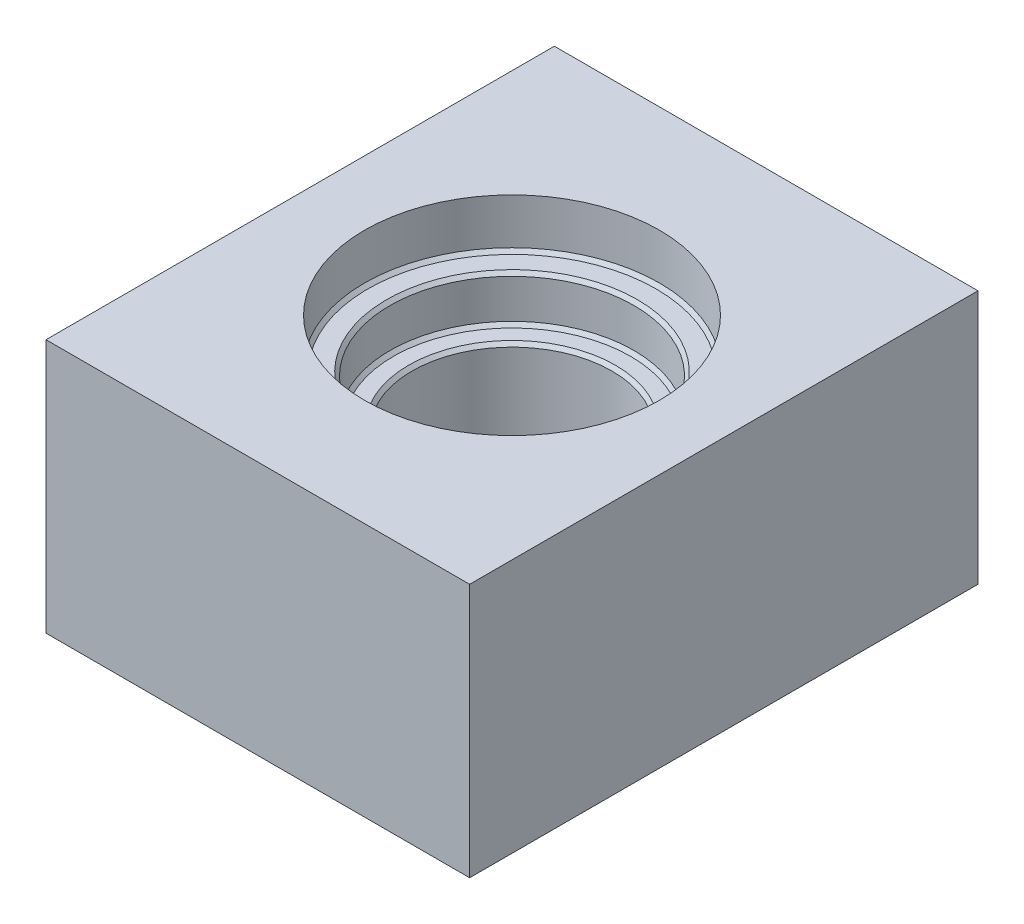
ISO-10303-21;
HEADER;
FILE_DESCRIPTION(('STEP AP214'),'2;1');
FILE_NAME('part.step','',(''),(''),'','','');
FILE_SCHEMA(('AUTOMOTIVE_DESIGN { 1 0 10303 214 1 1 1 1 }'));
ENDSEC;
DATA;
#1=APPLICATION_CONTEXT('core data for automotive mechanical design processes');
#2=APPLICATION_PROTOCOL_DEFINITION('international standard','automotive_design',2000,#1);
#3=PRODUCT_CONTEXT('',#1,'mechanical');
#4=PRODUCT('Part','Part','',(#3));
#5=PRODUCT_RELATED_PRODUCT_CATEGORY('part','',(#4));
#6=PRODUCT_DEFINITION_FORMATION('','',#4);
#7=PRODUCT_DEFINITION_CONTEXT('part definition',#1,'design');
#8=PRODUCT_DEFINITION('design','',#6,#7);
#9=PRODUCT_DEFINITION_SHAPE('','',#8);
#10=(LENGTH_UNIT() NAMED_UNIT(*) SI_UNIT(.MILLI.,.METRE.));
#11=(NAMED_UNIT(*) PLANE_ANGLE_UNIT() SI_UNIT($,.RADIAN.));
#12=(NAMED_UNIT(*) SI_UNIT($,.STERADIAN.) SOLID_ANGLE_UNIT());
#13=UNCERTAINTY_MEASURE_WITH_UNIT(LENGTH_MEASURE(1.E-05),#10,'distance_accuracy_value','');
#14=(GEOMETRIC_REPRESENTATION_CONTEXT(3) GLOBAL_UNCERTAINTY_ASSIGNED_CONTEXT((#13)) GLOBAL_UNIT_ASSIGNED_CONTEXT((#10,
#11,#12)) REPRESENTATION_CONTEXT('',''));
#15=CARTESIAN_POINT('',(0.,0.,0.));
#16=DIRECTION('',(0.,0.,1.));
#17=DIRECTION('',(1.,0.,0.));
#18=AXIS2_PLACEMENT_3D('',#15,#16,#17);
#19=CARTESIAN_POINT('',(-125.,0.,-150.));
#20=DIRECTION('',(-1.,0.,0.));
#21=DIRECTION('',(0.,0.,1.));
#22=AXIS2_PLACEMENT_3D('',#19,#20,#21);
#23=PLANE('',#22);
#24=DIRECTION('',(0.,0.,1.));
#25=VECTOR('',#24,1.);
#26=CARTESIAN_POINT('',(-125.,0.,-150.));
#27=LINE('',#26,#25);
#28=CARTESIAN_POINT('',(-125.,0.,-150.));
#29=VERTEX_POINT('',#28);
#30=CARTESIAN_POINT('',(-125.,0.,150.));
#31=VERTEX_POINT('',#30);
#32=EDGE_CURVE('E55',#29,#31,#27,.T.);
#33=ORIENTED_EDGE('',*,*,#32,.T.);
#34=DIRECTION('',(0.,-1.,0.));
#35=VECTOR('',#34,1.);
#36=CARTESIAN_POINT('',(-125.,0.,150.));
#37=LINE('',#36,#35);
#38=CARTESIAN_POINT('',(-125.,150.,150.));
#39=VERTEX_POINT('',#38);
#40=EDGE_CURVE('E106',#39,#31,#37,.T.);
#41=ORIENTED_EDGE('',*,*,#40,.F.);
#42=DIRECTION('',(0.,0.,1.));
#43=VECTOR('',#42,1.);
#44=CARTESIAN_POINT('',(-125.,150.,-150.));
#45=LINE('',#44,#43);
#46=CARTESIAN_POINT('',(-125.,150.,-150.));
#47=VERTEX_POINT('',#46);
#48=EDGE_CURVE('E12',#47,#39,#45,.T.);
#49=ORIENTED_EDGE('',*,*,#48,.F.);
#50=DIRECTION('',(0.,-1.,0.));
#51=VECTOR('',#50,1.);
#52=CARTESIAN_POINT('',(-125.,0.,-150.));
#53=LINE('',#52,#51);
#54=EDGE_CURVE('E332',#47,#29,#53,.T.);
#55=ORIENTED_EDGE('',*,*,#54,.T.);
#56=EDGE_LOOP('',(#33,#41,#49,#55));
#57=FACE_BOUND('',#56,.T.);
#58=ADVANCED_FACE('F52',(#57),#23,.T.);
#59=CARTESIAN_POINT('',(-125.,150.,-150.));
#60=DIRECTION('',(0.,1.,0.));
#61=DIRECTION('',(-1.,0.,0.));
#62=AXIS2_PLACEMENT_3D('',#59,#60,#61);
#63=PLANE('',#62);
#64=CARTESIAN_POINT('',(0.,150.,0.));
#65=DIRECTION('',(0.,-1.,0.));
#66=DIRECTION('',(0.,0.,-1.));
#67=AXIS2_PLACEMENT_3D('',#64,#65,#66);
#68=CIRCLE('',#67,87.);
#69=CARTESIAN_POINT('',(0.,150.,-87.));
#70=VERTEX_POINT('',#69);
#71=EDGE_CURVE('E331',#70,#70,#68,.T.);
#72=ORIENTED_EDGE('',*,*,#71,.T.);
#73=EDGE_LOOP('',(#72));
#74=FACE_BOUND('',#73,.T.);
#75=DIRECTION('',(-1.,0.,0.));
#76=VECTOR('',#75,1.);
#77=CARTESIAN_POINT('',(-125.,150.,150.));
#78=LINE('',#77,#76);
#79=CARTESIAN_POINT('',(125.,150.,150.));
#80=VERTEX_POINT('',#79);
#81=EDGE_CURVE('E98',#80,#39,#78,.T.);
#82=ORIENTED_EDGE('',*,*,#81,.F.);
#83=DIRECTION('',(0.,0.,1.));
#84=VECTOR('',#83,1.);
#85=CARTESIAN_POINT('',(125.,150.,-150.));
#86=LINE('',#85,#84);
#87=CARTESIAN_POINT('',(125.,150.,-150.));
#88=VERTEX_POINT('',#87);
#89=EDGE_CURVE('E62',#88,#80,#86,.T.);
#90=ORIENTED_EDGE('',*,*,#89,.F.);
#91=DIRECTION('',(-1.,0.,0.));
#92=VECTOR('',#91,1.);
#93=CARTESIAN_POINT('',(-125.,150.,-150.));
#94=LINE('',#93,#92);
#95=EDGE_CURVE('E100',#88,#47,#94,.T.);
#96=ORIENTED_EDGE('',*,*,#95,.T.);
#97=ORIENTED_EDGE('',*,*,#48,.T.);
#98=EDGE_LOOP('',(#82,#90,#96,#97));
#99=FACE_BOUND('',#98,.T.);
#100=ADVANCED_FACE('F97',(#74,#99),#63,.T.);
#101=CARTESIAN_POINT('',(125.,0.,-150.));
#102=DIRECTION('',(1.,0.,0.));
#103=DIRECTION('',(0.,1.,0.));
#104=AXIS2_PLACEMENT_3D('',#101,#102,#103);
#105=PLANE('',#104);
#106=ORIENTED_EDGE('',*,*,#89,.T.);
#107=DIRECTION('',(0.,1.,0.));
#108=VECTOR('',#107,1.);
#109=CARTESIAN_POINT('',(125.,0.,150.));
#110=LINE('',#109,#108);
#111=CARTESIAN_POINT('',(125.,0.,150.));
#112=VERTEX_POINT('',#111);
#113=EDGE_CURVE('E108',#112,#80,#110,.T.);
#114=ORIENTED_EDGE('',*,*,#113,.F.);
#115=DIRECTION('',(0.,0.,1.));
#116=VECTOR('',#115,1.);
#117=CARTESIAN_POINT('',(125.,0.,-150.));
#118=LINE('',#117,#116);
#119=CARTESIAN_POINT('',(125.,0.,-150.));
#120=VERTEX_POINT('',#119);
#121=EDGE_CURVE('E236',#120,#112,#118,.T.);
#122=ORIENTED_EDGE('',*,*,#121,.F.);
#123=DIRECTION('',(0.,1.,0.));
#124=VECTOR('',#123,1.);
#125=CARTESIAN_POINT('',(125.,0.,-150.));
#126=LINE('',#125,#124);
#127=EDGE_CURVE('E337',#120,#88,#126,.T.);
#128=ORIENTED_EDGE('',*,*,#127,.T.);
#129=EDGE_LOOP('',(#106,#114,#122,#128));
#130=FACE_BOUND('',#129,.T.);
#131=ADVANCED_FACE('F215',(#130),#105,.T.);
#132=CARTESIAN_POINT('',(-125.,0.,-150.));
#133=DIRECTION('',(0.,-1.,0.));
#134=DIRECTION('',(0.,0.,-1.));
#135=AXIS2_PLACEMENT_3D('',#132,#133,#134);
#136=PLANE('',#135);
#137=ORIENTED_EDGE('',*,*,#121,.T.);
#138=DIRECTION('',(1.,0.,0.));
#139=VECTOR('',#138,1.);
#140=CARTESIAN_POINT('',(-125.,0.,150.));
#141=LINE('',#140,#139);
#142=EDGE_CURVE('E237',#31,#112,#141,.T.);
#143=ORIENTED_EDGE('',*,*,#142,.F.);
#144=ORIENTED_EDGE('',*,*,#32,.F.);
#145=DIRECTION('',(1.,0.,0.));
#146=VECTOR('',#145,1.);
#147=CARTESIAN_POINT('',(-125.,0.,-150.));
#148=LINE('',#147,#146);
#149=EDGE_CURVE('E239',#29,#120,#148,.T.);
#150=ORIENTED_EDGE('',*,*,#149,.T.);
#151=EDGE_LOOP('',(#137,#143,#144,#150));
#152=FACE_BOUND('',#151,.T.);
#153=ADVANCED_FACE('F221',(#152),#136,.T.);
#154=CARTESIAN_POINT('',(0.,0.,-150.));
#155=DIRECTION('',(0.,0.,-1.));
#156=DIRECTION('',(-1.,0.,0.));
#157=AXIS2_PLACEMENT_3D('',#154,#155,#156);
#158=PLANE('',#157);
#159=ORIENTED_EDGE('',*,*,#54,.F.);
#160=ORIENTED_EDGE('',*,*,#95,.F.);
#161=ORIENTED_EDGE('',*,*,#127,.F.);
#162=ORIENTED_EDGE('',*,*,#149,.F.);
#163=EDGE_LOOP('',(#159,#160,#161,#162));
#164=FACE_BOUND('',#163,.T.);
#165=ADVANCED_FACE('F226',(#164),#158,.T.);
#166=CARTESIAN_POINT('',(0.,0.,0.));
#167=DIRECTION('',(0.,-1.,0.));
#168=DIRECTION('',(0.,0.,-1.));
#169=AXIS2_PLACEMENT_3D('',#166,#167,#168);
#170=CYLINDRICAL_SURFACE('',#169,87.);
#171=ORIENTED_EDGE('',*,*,#71,.F.);
#172=EDGE_LOOP('',(#171));
#173=FACE_BOUND('',#172,.T.);
#174=CARTESIAN_POINT('',(0.,123.,0.));
#175=DIRECTION('',(0.,-1.,0.));
#176=DIRECTION('',(0.,0.,-1.));
#177=AXIS2_PLACEMENT_3D('',#174,#175,#176);
#178=CIRCLE('',#177,87.);
#179=CARTESIAN_POINT('',(0.,123.,-87.));
#180=VERTEX_POINT('',#179);
#181=EDGE_CURVE('E162',#180,#180,#178,.T.);
#182=ORIENTED_EDGE('',*,*,#181,.T.);
#183=EDGE_LOOP('',(#182));
#184=FACE_BOUND('',#183,.T.);
#185=ADVANCED_FACE('F233',(#173,#184),#170,.F.);
#186=CARTESIAN_POINT('',(0.,121.,0.));
#187=DIRECTION('',(0.,1.,0.));
#188=DIRECTION('',(0.,0.,1.));
#189=AXIS2_PLACEMENT_3D('',#186,#187,#188);
#190=CONICAL_SURFACE('',#189,85.,0.785398163397445);
#191=CARTESIAN_POINT('',(0.,121.,0.));
#192=DIRECTION('',(0.,-1.,0.));
#193=DIRECTION('',(0.,0.,-1.));
#194=AXIS2_PLACEMENT_3D('',#191,#192,#193);
#195=CIRCLE('',#194,85.);
#196=CARTESIAN_POINT('',(0.,121.,-85.));
#197=VERTEX_POINT('',#196);
#198=EDGE_CURVE('E154',#197,#197,#195,.T.);
#199=ORIENTED_EDGE('',*,*,#198,.T.);
#200=EDGE_LOOP('',(#199));
#201=FACE_BOUND('',#200,.T.);
#202=ORIENTED_EDGE('',*,*,#181,.F.);
#203=EDGE_LOOP('',(#202));
#204=FACE_BOUND('',#203,.T.);
#205=ADVANCED_FACE('F376',(#201,#204),#190,.F.);
#206=CARTESIAN_POINT('',(85.,121.,0.));
#207=DIRECTION('',(0.,-1.,0.));
#208=DIRECTION('',(0.,0.,-1.));
#209=AXIS2_PLACEMENT_3D('',#206,#207,#208);
#210=PLANE('',#209);
#211=ORIENTED_EDGE('',*,*,#198,.F.);
#212=EDGE_LOOP('',(#211));
#213=FACE_BOUND('',#212,.T.);
#214=CARTESIAN_POINT('',(0.,121.,0.));
#215=DIRECTION('',(0.,-1.,0.));
#216=DIRECTION('',(0.,0.,-1.));
#217=AXIS2_PLACEMENT_3D('',#214,#215,#216);
#218=CIRCLE('',#217,74.);
#219=CARTESIAN_POINT('',(0.,121.,-74.));
#220=VERTEX_POINT('',#219);
#221=EDGE_CURVE('E148',#220,#220,#218,.T.);
#222=ORIENTED_EDGE('',*,*,#221,.T.);
#223=EDGE_LOOP('',(#222));
#224=FACE_BOUND('',#223,.T.);
#225=ADVANCED_FACE('F373',(#213,#224),#210,.F.);
#226=CARTESIAN_POINT('',(0.,119.,0.));
#227=DIRECTION('',(0.,1.,0.));
#228=DIRECTION('',(0.,0.,1.));
#229=AXIS2_PLACEMENT_3D('',#226,#227,#228);
#230=CONICAL_SURFACE('',#229,72.,0.785398163397452);
#231=CARTESIAN_POINT('',(0.,119.,0.));
#232=DIRECTION('',(0.,-1.,0.));
#233=DIRECTION('',(0.,0.,-1.));
#234=AXIS2_PLACEMENT_3D('',#231,#232,#233);
#235=CIRCLE('',#234,72.);
#236=CARTESIAN_POINT('',(0.,119.,-72.));
#237=VERTEX_POINT('',#236);
#238=EDGE_CURVE('E155',#237,#237,#235,.T.);
#239=ORIENTED_EDGE('',*,*,#238,.T.);
#240=EDGE_LOOP('',(#239));
#241=FACE_BOUND('',#240,.T.);
#242=ORIENTED_EDGE('',*,*,#221,.F.);
#243=EDGE_LOOP('',(#242));
#244=FACE_BOUND('',#243,.T.);
#245=ADVANCED_FACE('F350',(#241,#244),#230,.F.);
#246=CARTESIAN_POINT('',(0.,0.,0.));
#247=DIRECTION('',(0.,-1.,0.));
#248=DIRECTION('',(0.,0.,-1.));
#249=AXIS2_PLACEMENT_3D('',#246,#247,#248);
#250=CYLINDRICAL_SURFACE('',#249,72.);
#251=ORIENTED_EDGE('',*,*,#238,.F.);
#252=EDGE_LOOP('',(#251));
#253=FACE_BOUND('',#252,.T.);
#254=CARTESIAN_POINT('',(0.,96.0000000000001,0.));
#255=DIRECTION('',(0.,-1.,0.));
#256=DIRECTION('',(0.,0.,-1.));
#257=AXIS2_PLACEMENT_3D('',#254,#255,#256);
#258=CIRCLE('',#257,72.);
#259=CARTESIAN_POINT('',(0.,96.0000000000001,-72.));
#260=VERTEX_POINT('',#259);
#261=EDGE_CURVE('E171',#260,#260,#258,.T.);
#262=ORIENTED_EDGE('',*,*,#261,.T.);
#263=EDGE_LOOP('',(#262));
#264=FACE_BOUND('',#263,.T.);
#265=ADVANCED_FACE('F353',(#253,#264),#250,.F.);
#266=CARTESIAN_POINT('',(0.,94.0000000000001,0.));
#267=DIRECTION('',(0.,1.,0.));
#268=DIRECTION('',(0.,0.,1.));
#269=AXIS2_PLACEMENT_3D('',#266,#267,#268);
#270=CONICAL_SURFACE('',#269,70.,0.785398163397445);
#271=CARTESIAN_POINT('',(0.,94.0000000000001,0.));
#272=DIRECTION('',(0.,-1.,0.));
#273=DIRECTION('',(0.,0.,-1.));
#274=AXIS2_PLACEMENT_3D('',#271,#272,#273);
#275=CIRCLE('',#274,70.);
#276=CARTESIAN_POINT('',(0.,94.0000000000001,-70.));
#277=VERTEX_POINT('',#276);
#278=EDGE_CURVE('E175',#277,#277,#275,.T.);
#279=ORIENTED_EDGE('',*,*,#278,.T.);
#280=EDGE_LOOP('',(#279));
#281=FACE_BOUND('',#280,.T.);
#282=ORIENTED_EDGE('',*,*,#261,.F.);
#283=EDGE_LOOP('',(#282));
#284=FACE_BOUND('',#283,.T.);
#285=ADVANCED_FACE('F356',(#281,#284),#270,.F.);
#286=CARTESIAN_POINT('',(70.,94.0000000000001,0.));
#287=DIRECTION('',(0.,-1.,0.));
#288=DIRECTION('',(0.,0.,-1.));
#289=AXIS2_PLACEMENT_3D('',#286,#287,#288);
#290=PLANE('',#289);
#291=ORIENTED_EDGE('',*,*,#278,.F.);
#292=EDGE_LOOP('',(#291));
#293=FACE_BOUND('',#292,.T.);
#294=CARTESIAN_POINT('',(0.,94.0000000000001,0.));
#295=DIRECTION('',(0.,-1.,0.));
#296=DIRECTION('',(0.,0.,-1.));
#297=AXIS2_PLACEMENT_3D('',#294,#295,#296);
#298=CIRCLE('',#297,61.);
#299=CARTESIAN_POINT('',(0.,94.0000000000001,-61.));
#300=VERTEX_POINT('',#299);
#301=EDGE_CURVE('E179',#300,#300,#298,.T.);
#302=ORIENTED_EDGE('',*,*,#301,.T.);
#303=EDGE_LOOP('',(#302));
#304=FACE_BOUND('',#303,.T.);
#305=ADVANCED_FACE('F361',(#293,#304),#290,.F.);
#306=CARTESIAN_POINT('',(0.,92.0000000000001,0.));
#307=DIRECTION('',(0.,1.,0.));
#308=DIRECTION('',(0.,0.,1.));
#309=AXIS2_PLACEMENT_3D('',#306,#307,#308);
#310=CONICAL_SURFACE('',#309,59.,0.78539816339745);
#311=CARTESIAN_POINT('',(0.,92.0000000000001,0.));
#312=DIRECTION('',(0.,-1.,0.));
#313=DIRECTION('',(0.,0.,-1.));
#314=AXIS2_PLACEMENT_3D('',#311,#312,#313);
#315=CIRCLE('',#314,59.);
#316=CARTESIAN_POINT('',(0.,92.0000000000001,-59.));
#317=VERTEX_POINT('',#316);
#318=EDGE_CURVE('E183',#317,#317,#315,.T.);
#319=ORIENTED_EDGE('',*,*,#318,.T.);
#320=EDGE_LOOP('',(#319));
#321=FACE_BOUND('',#320,.T.);
#322=ORIENTED_EDGE('',*,*,#301,.F.);
#323=EDGE_LOOP('',(#322));
#324=FACE_BOUND('',#323,.T.);
#325=ADVANCED_FACE('F208',(#321,#324),#310,.F.);
#326=CARTESIAN_POINT('',(0.,0.,0.));
#327=DIRECTION('',(0.,-1.,0.));
#328=DIRECTION('',(0.,0.,-1.));
#329=AXIS2_PLACEMENT_3D('',#326,#327,#328);
#330=CYLINDRICAL_SURFACE('',#329,59.);
#331=ORIENTED_EDGE('',*,*,#318,.F.);
#332=EDGE_LOOP('',(#331));
#333=FACE_BOUND('',#332,.T.);
#334=CARTESIAN_POINT('',(0.,46.,0.));
#335=DIRECTION('',(0.,-1.,0.));
#336=DIRECTION('',(0.,0.,-1.));
#337=AXIS2_PLACEMENT_3D('',#334,#335,#336);
#338=CIRCLE('',#337,59.);
#339=CARTESIAN_POINT('',(0.,46.,-59.));
#340=VERTEX_POINT('',#339);
#341=EDGE_CURVE('E138',#340,#340,#338,.T.);
#342=ORIENTED_EDGE('',*,*,#341,.T.);
#343=EDGE_LOOP('',(#342));
#344=FACE_BOUND('',#343,.T.);
#345=ADVANCED_FACE('F194',(#333,#344),#330,.F.);
#346=CARTESIAN_POINT('',(0.,44.,0.));
#347=DIRECTION('',(0.,1.,0.));
#348=DIRECTION('',(0.,0.,1.));
#349=AXIS2_PLACEMENT_3D('',#346,#347,#348);
#350=CONICAL_SURFACE('',#349,57.,0.785398163397447);
#351=CARTESIAN_POINT('',(0.,44.,0.));
#352=DIRECTION('',(0.,-1.,0.));
#353=DIRECTION('',(0.,0.,-1.));
#354=AXIS2_PLACEMENT_3D('',#351,#352,#353);
#355=CIRCLE('',#354,57.);
#356=CARTESIAN_POINT('',(0.,44.,-57.));
#357=VERTEX_POINT('',#356);
#358=EDGE_CURVE('E131',#357,#357,#355,.T.);
#359=ORIENTED_EDGE('',*,*,#358,.T.);
#360=EDGE_LOOP('',(#359));
#361=FACE_BOUND('',#360,.T.);
#362=ORIENTED_EDGE('',*,*,#341,.F.);
#363=EDGE_LOOP('',(#362));
#364=FACE_BOUND('',#363,.T.);
#365=ADVANCED_FACE('F196',(#361,#364),#350,.F.);
#366=CARTESIAN_POINT('',(57.,44.,0.));
#367=DIRECTION('',(0.,-1.,0.));
#368=DIRECTION('',(0.,0.,-1.));
#369=AXIS2_PLACEMENT_3D('',#366,#367,#368);
#370=PLANE('',#369);
#371=ORIENTED_EDGE('',*,*,#358,.F.);
#372=EDGE_LOOP('',(#371));
#373=FACE_BOUND('',#372,.T.);
#374=CARTESIAN_POINT('',(0.,44.,0.));
#375=DIRECTION('',(0.,-1.,0.));
#376=DIRECTION('',(0.,0.,-1.));
#377=AXIS2_PLACEMENT_3D('',#374,#375,#376);
#378=CIRCLE('',#377,43.);
#379=CARTESIAN_POINT('',(0.,44.,-43.));
#380=VERTEX_POINT('',#379);
#381=EDGE_CURVE('E125',#380,#380,#378,.T.);
#382=ORIENTED_EDGE('',*,*,#381,.T.);
#383=EDGE_LOOP('',(#382));
#384=FACE_BOUND('',#383,.T.);
#385=ADVANCED_FACE('F198',(#373,#384),#370,.F.);
#386=CARTESIAN_POINT('',(0.,42.,0.));
#387=DIRECTION('',(0.,1.,0.));
#388=DIRECTION('',(0.,0.,1.));
#389=AXIS2_PLACEMENT_3D('',#386,#387,#388);
#390=CONICAL_SURFACE('',#389,41.,0.78539816339745);
#391=CARTESIAN_POINT('',(0.,42.,0.));
#392=DIRECTION('',(0.,-1.,0.));
#393=DIRECTION('',(0.,0.,-1.));
#394=AXIS2_PLACEMENT_3D('',#391,#392,#393);
#395=CIRCLE('',#394,41.);
#396=CARTESIAN_POINT('',(0.,42.,-41.));
#397=VERTEX_POINT('',#396);
#398=EDGE_CURVE('E132',#397,#397,#395,.T.);
#399=ORIENTED_EDGE('',*,*,#398,.T.);
#400=EDGE_LOOP('',(#399));
#401=FACE_BOUND('',#400,.T.);
#402=ORIENTED_EDGE('',*,*,#381,.F.);
#403=EDGE_LOOP('',(#402));
#404=FACE_BOUND('',#403,.T.);
#405=ADVANCED_FACE('F205',(#401,#404),#390,.F.);
#406=CARTESIAN_POINT('',(0.,0.,0.));
#407=DIRECTION('',(0.,-1.,0.));
#408=DIRECTION('',(0.,0.,-1.));
#409=AXIS2_PLACEMENT_3D('',#406,#407,#408);
#410=CYLINDRICAL_SURFACE('',#409,41.);
#411=ORIENTED_EDGE('',*,*,#398,.F.);
#412=EDGE_LOOP('',(#411));
#413=FACE_BOUND('',#412,.T.);
#414=CARTESIAN_POINT('',(0.,36.,0.));
#415=DIRECTION('',(0.,-1.,0.));
#416=DIRECTION('',(0.,0.,-1.));
#417=AXIS2_PLACEMENT_3D('',#414,#415,#416);
#418=CIRCLE('',#417,41.);
#419=CARTESIAN_POINT('',(0.,36.,-41.));
#420=VERTEX_POINT('',#419);
#421=EDGE_CURVE('E249',#420,#420,#418,.T.);
#422=ORIENTED_EDGE('',*,*,#421,.T.);
#423=EDGE_LOOP('',(#422));
#424=FACE_BOUND('',#423,.T.);
#425=ADVANCED_FACE('F260',(#413,#424),#410,.F.);
#426=CARTESIAN_POINT('',(0.,34.,0.));
#427=DIRECTION('',(0.,1.,0.));
#428=DIRECTION('',(0.,0.,1.));
#429=AXIS2_PLACEMENT_3D('',#426,#427,#428);
#430=CONICAL_SURFACE('',#429,39.,0.785398163397442);
#431=CARTESIAN_POINT('',(0.,34.,0.));
#432=DIRECTION('',(0.,-1.,0.));
#433=DIRECTION('',(0.,0.,-1.));
#434=AXIS2_PLACEMENT_3D('',#431,#432,#433);
#435=CIRCLE('',#434,39.);
#436=CARTESIAN_POINT('',(0.,34.,-39.));
#437=VERTEX_POINT('',#436);
#438=EDGE_CURVE('E243',#437,#437,#435,.T.);
#439=ORIENTED_EDGE('',*,*,#438,.T.);
#440=EDGE_LOOP('',(#439));
#441=FACE_BOUND('',#440,.T.);
#442=ORIENTED_EDGE('',*,*,#421,.F.);
#443=EDGE_LOOP('',(#442));
#444=FACE_BOUND('',#443,.T.);
#445=ADVANCED_FACE('F262',(#441,#444),#430,.F.);
#446=CARTESIAN_POINT('',(39.,34.,0.));
#447=DIRECTION('',(0.,-1.,0.));
#448=DIRECTION('',(0.,0.,-1.));
#449=AXIS2_PLACEMENT_3D('',#446,#447,#448);
#450=PLANE('',#449);
#451=ORIENTED_EDGE('',*,*,#438,.F.);
#452=EDGE_LOOP('',(#451));
#453=FACE_BOUND('',#452,.T.);
#454=ADVANCED_FACE('F268',(#453),#450,.F.);
#455=CARTESIAN_POINT('',(0.,0.,150.));
#456=DIRECTION('',(0.,0.,1.));
#457=DIRECTION('',(-1.,0.,0.));
#458=AXIS2_PLACEMENT_3D('',#455,#456,#457);
#459=PLANE('',#458);
#460=ORIENTED_EDGE('',*,*,#40,.T.);
#461=ORIENTED_EDGE('',*,*,#142,.T.);
#462=ORIENTED_EDGE('',*,*,#113,.T.);
#463=ORIENTED_EDGE('',*,*,#81,.T.);
#464=EDGE_LOOP('',(#460,#461,#462,#463));
#465=FACE_BOUND('',#464,.T.);
#466=ADVANCED_FACE('F104',(#465),#459,.T.);
#467=CLOSED_SHELL('',(#58,#100,#131,#153,#165,#185,#205,#225,#245,#265,#285,#305,#325,#345,#365,
#385,#405,#425,#445,#454,#466));
#468=MANIFOLD_SOLID_BREP('B2',#467);
#469=ADVANCED_BREP_SHAPE_REPRESENTATION('',(#18,#468),#14);
#470=SHAPE_DEFINITION_REPRESENTATION(#9,#469);
ENDSEC;
END-ISO-10303-21;
